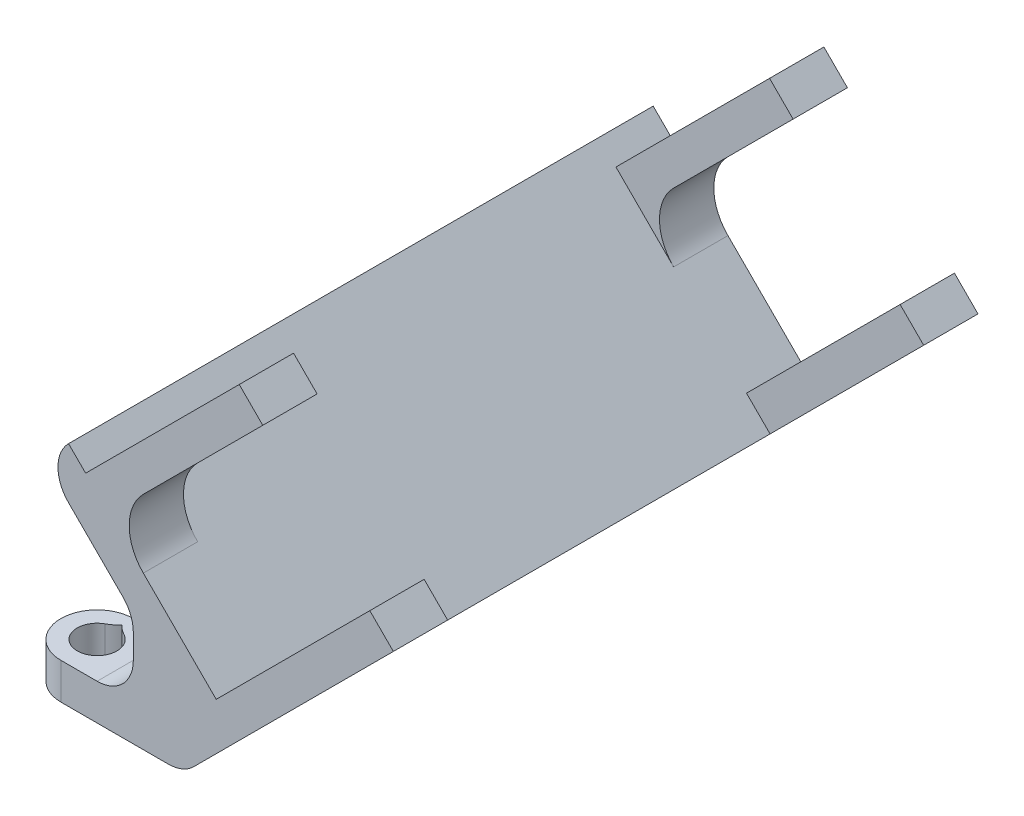
ISO-10303-21;
HEADER;
FILE_DESCRIPTION(('STEP AP214'),'2;1');
FILE_NAME('part.step','',(''),(''),'','','');
FILE_SCHEMA(('AUTOMOTIVE_DESIGN { 1 0 10303 214 1 1 1 1 }'));
ENDSEC;
DATA;
#1=APPLICATION_CONTEXT('core data for automotive mechanical design processes');
#2=APPLICATION_PROTOCOL_DEFINITION('international standard','automotive_design',2000,#1);
#3=PRODUCT_CONTEXT('',#1,'mechanical');
#4=PRODUCT('Part','Part','',(#3));
#5=PRODUCT_RELATED_PRODUCT_CATEGORY('part','',(#4));
#6=PRODUCT_DEFINITION_FORMATION('','',#4);
#7=PRODUCT_DEFINITION_CONTEXT('part definition',#1,'design');
#8=PRODUCT_DEFINITION('design','',#6,#7);
#9=PRODUCT_DEFINITION_SHAPE('','',#8);
#10=(LENGTH_UNIT() NAMED_UNIT(*) SI_UNIT(.MILLI.,.METRE.));
#11=(NAMED_UNIT(*) PLANE_ANGLE_UNIT() SI_UNIT($,.RADIAN.));
#12=(NAMED_UNIT(*) SI_UNIT($,.STERADIAN.) SOLID_ANGLE_UNIT());
#13=UNCERTAINTY_MEASURE_WITH_UNIT(LENGTH_MEASURE(1.E-05),#10,'distance_accuracy_value','');
#14=(GEOMETRIC_REPRESENTATION_CONTEXT(3) GLOBAL_UNCERTAINTY_ASSIGNED_CONTEXT((#13)) GLOBAL_UNIT_ASSIGNED_CONTEXT((#10,
#11,#12)) REPRESENTATION_CONTEXT('',''));
#15=CARTESIAN_POINT('',(0.,0.,0.));
#16=DIRECTION('',(0.,0.,1.));
#17=DIRECTION('',(1.,0.,0.));
#18=AXIS2_PLACEMENT_3D('',#15,#16,#17);
#19=CARTESIAN_POINT('',(-7.70161471607487,7.70161471607495,-24.22));
#20=DIRECTION('',(0.707106781186544,-0.707106781186551,0.));
#21=DIRECTION('',(0.707106781186551,0.707106781186544,0.));
#22=AXIS2_PLACEMENT_3D('',#19,#20,#21);
#23=PLANE('',#22);
#24=DIRECTION('',(0.,0.,1.));
#25=VECTOR('',#24,1.);
#26=CARTESIAN_POINT('',(2.04838528392516,17.4516147160749,-24.22));
#27=LINE('',#26,#25);
#28=CARTESIAN_POINT('',(2.04838528392516,17.4516147160749,-24.22));
#29=VERTEX_POINT('',#28);
#30=CARTESIAN_POINT('',(2.04838528392517,17.4516147160749,-19.72));
#31=VERTEX_POINT('',#30);
#32=EDGE_CURVE('E268',#29,#31,#27,.T.);
#33=ORIENTED_EDGE('',*,*,#32,.T.);
#34=DIRECTION('',(-0.707106781186551,-0.707106781186544,0.));
#35=VECTOR('',#34,1.);
#36=CARTESIAN_POINT('',(14.7763073452831,30.1795367774327,-19.72));
#37=LINE('',#36,#35);
#38=CARTESIAN_POINT('',(14.7763073452831,30.1795367774327,-19.72));
#39=VERTEX_POINT('',#38);
#40=EDGE_CURVE('E278',#39,#31,#37,.T.);
#41=ORIENTED_EDGE('',*,*,#40,.F.);
#42=DIRECTION('',(0.,0.,1.));
#43=VECTOR('',#42,1.);
#44=CARTESIAN_POINT('',(14.7763073452831,30.1795367774327,-24.22));
#45=LINE('',#44,#43);
#46=CARTESIAN_POINT('',(14.7763073452831,30.1795367774327,-24.22));
#47=VERTEX_POINT('',#46);
#48=EDGE_CURVE('E293',#47,#39,#45,.T.);
#49=ORIENTED_EDGE('',*,*,#48,.F.);
#50=DIRECTION('',(0.707106781186551,0.707106781186544,0.));
#51=VECTOR('',#50,1.);
#52=CARTESIAN_POINT('',(-7.70161471607487,7.70161471607495,-24.22));
#53=LINE('',#52,#51);
#54=EDGE_CURVE('E286',#29,#47,#53,.T.);
#55=ORIENTED_EDGE('',*,*,#54,.F.);
#56=EDGE_LOOP('',(#33,#41,#49,#55));
#57=FACE_BOUND('',#56,.T.);
#58=ADVANCED_FACE('F35',(#57),#23,.F.);
#59=CARTESIAN_POINT('',(22.477922061358,22.4779220613577,-24.22));
#60=DIRECTION('',(0.707106781186551,0.707106781186544,0.));
#61=DIRECTION('',(-0.707106781186544,0.707106781186551,0.));
#62=AXIS2_PLACEMENT_3D('',#59,#60,#61);
#63=PLANE('',#62);
#64=DIRECTION('',(-0.707106781186544,0.707106781186551,0.));
#65=VECTOR('',#64,1.);
#66=CARTESIAN_POINT('',(36.2512499681139,8.70459415460168,-19.72));
#67=LINE('',#66,#65);
#68=CARTESIAN_POINT('',(16.7279220613579,28.2279220613578,-19.72));
#69=VERTEX_POINT('',#68);
#70=EDGE_CURVE('E281',#69,#39,#67,.T.);
#71=ORIENTED_EDGE('',*,*,#70,.F.);
#72=DIRECTION('',(0.,0.,1.));
#73=VECTOR('',#72,1.);
#74=CARTESIAN_POINT('',(16.7279220613579,28.2279220613578,-24.22));
#75=LINE('',#74,#73);
#76=CARTESIAN_POINT('',(16.7279220613579,28.2279220613578,-24.22));
#77=VERTEX_POINT('',#76);
#78=EDGE_CURVE('E298',#77,#69,#75,.T.);
#79=ORIENTED_EDGE('',*,*,#78,.F.);
#80=DIRECTION('',(-0.707106781186544,0.707106781186551,0.));
#81=VECTOR('',#80,1.);
#82=CARTESIAN_POINT('',(22.477922061358,22.4779220613577,-24.22));
#83=LINE('',#82,#81);
#84=EDGE_CURVE('E512',#77,#47,#83,.T.);
#85=ORIENTED_EDGE('',*,*,#84,.T.);
#86=ORIENTED_EDGE('',*,*,#48,.T.);
#87=EDGE_LOOP('',(#71,#79,#85,#86));
#88=FACE_BOUND('',#87,.T.);
#89=ADVANCED_FACE('F597',(#88),#63,.T.);
#90=CARTESIAN_POINT('',(-5.75000000000001,5.75000000000007,-24.22));
#91=DIRECTION('',(0.707106781186544,-0.707106781186551,0.));
#92=DIRECTION('',(0.707106781186551,0.707106781186544,0.));
#93=AXIS2_PLACEMENT_3D('',#90,#91,#92);
#94=PLANE('',#93);
#95=DIRECTION('',(0.707106781186551,0.707106781186544,0.));
#96=VECTOR('',#95,1.);
#97=CARTESIAN_POINT('',(-5.75000000000001,5.75000000000007,-19.72));
#98=LINE('',#97,#96);
#99=CARTESIAN_POINT('',(6.82842712474622,18.3284271247462,-19.72));
#100=VERTEX_POINT('',#99);
#101=EDGE_CURVE('E465',#100,#69,#98,.T.);
#102=ORIENTED_EDGE('',*,*,#101,.F.);
#103=DIRECTION('',(0.,0.,1.));
#104=VECTOR('',#103,1.);
#105=CARTESIAN_POINT('',(6.82842712474622,18.3284271247462,-24.22));
#106=LINE('',#105,#104);
#107=CARTESIAN_POINT('',(6.82842712474623,18.3284271247462,-24.22));
#108=VERTEX_POINT('',#107);
#109=EDGE_CURVE('E442',#100,#108,#106,.F.);
#110=ORIENTED_EDGE('',*,*,#109,.T.);
#111=DIRECTION('',(0.707106781186551,0.707106781186544,0.));
#112=VECTOR('',#111,1.);
#113=CARTESIAN_POINT('',(-5.75000000000001,5.75000000000007,-24.22));
#114=LINE('',#113,#112);
#115=EDGE_CURVE('E456',#108,#77,#114,.T.);
#116=ORIENTED_EDGE('',*,*,#115,.T.);
#117=ORIENTED_EDGE('',*,*,#78,.T.);
#118=EDGE_LOOP('',(#102,#110,#116,#117));
#119=FACE_BOUND('',#118,.T.);
#120=ADVANCED_FACE('F467',(#119),#94,.T.);
#121=CARTESIAN_POINT('',(3.11711903607925,-3.11711903607928,-24.22));
#122=DIRECTION('',(0.707106781186544,-0.707106781186551,0.));
#123=DIRECTION('',(0.707106781186551,0.707106781186544,0.));
#124=AXIS2_PLACEMENT_3D('',#121,#122,#123);
#125=PLANE('',#124);
#126=DIRECTION('',(0.,0.,1.));
#127=VECTOR('',#126,1.);
#128=CARTESIAN_POINT('',(12.8671190360793,6.63288096392065,-24.22));
#129=LINE('',#128,#127);
#130=CARTESIAN_POINT('',(12.8671190360793,6.63288096392065,-24.22));
#131=VERTEX_POINT('',#130);
#132=CARTESIAN_POINT('',(12.8671190360793,6.63288096392065,-19.72));
#133=VERTEX_POINT('',#132);
#134=EDGE_CURVE('E302',#131,#133,#129,.T.);
#135=ORIENTED_EDGE('',*,*,#134,.T.);
#136=DIRECTION('',(0.707106781186551,0.707106781186544,0.));
#137=VECTOR('',#136,1.);
#138=CARTESIAN_POINT('',(3.11711903607925,-3.11711903607928,-19.72));
#139=LINE('',#138,#137);
#140=CARTESIAN_POINT('',(25.5950410974372,19.3608030252784,-19.72));
#141=VERTEX_POINT('',#140);
#142=EDGE_CURVE('E470',#133,#141,#139,.T.);
#143=ORIENTED_EDGE('',*,*,#142,.T.);
#144=DIRECTION('',(0.,0.,1.));
#145=VECTOR('',#144,1.);
#146=CARTESIAN_POINT('',(25.5950410974372,19.3608030252784,-24.22));
#147=LINE('',#146,#145);
#148=CARTESIAN_POINT('',(25.5950410974372,19.3608030252784,-24.22));
#149=VERTEX_POINT('',#148);
#150=EDGE_CURVE('E306',#149,#141,#147,.T.);
#151=ORIENTED_EDGE('',*,*,#150,.F.);
#152=DIRECTION('',(0.707106781186551,0.707106781186544,0.));
#153=VECTOR('',#152,1.);
#154=CARTESIAN_POINT('',(3.11711903607925,-3.11711903607928,-24.22));
#155=LINE('',#154,#153);
#156=EDGE_CURVE('E461',#131,#149,#155,.T.);
#157=ORIENTED_EDGE('',*,*,#156,.F.);
#158=EDGE_LOOP('',(#135,#143,#151,#157));
#159=FACE_BOUND('',#158,.T.);
#160=ADVANCED_FACE('F626',(#159),#125,.F.);
#161=CARTESIAN_POINT('',(22.477922061358,22.4779220613577,-24.22));
#162=DIRECTION('',(0.707106781186553,0.707106781186542,0.));
#163=DIRECTION('',(-0.707106781186542,0.707106781186553,0.));
#164=AXIS2_PLACEMENT_3D('',#161,#162,#163);
#165=PLANE('',#164);
#166=CARTESIAN_POINT('',(27.5466558135121,17.4091883092036,-19.72));
#167=VERTEX_POINT('',#166);
#168=EDGE_CURVE('E555',#167,#141,#67,.T.);
#169=ORIENTED_EDGE('',*,*,#168,.F.);
#170=DIRECTION('',(0.,0.,1.));
#171=VECTOR('',#170,1.);
#172=CARTESIAN_POINT('',(27.5466558135121,17.4091883092036,-24.22));
#173=LINE('',#172,#171);
#174=CARTESIAN_POINT('',(27.5466558135121,17.4091883092036,-24.22));
#175=VERTEX_POINT('',#174);
#176=EDGE_CURVE('E310',#175,#167,#173,.T.);
#177=ORIENTED_EDGE('',*,*,#176,.F.);
#178=DIRECTION('',(-0.707106781186542,0.707106781186553,0.));
#179=VECTOR('',#178,1.);
#180=CARTESIAN_POINT('',(22.477922061358,22.4779220613577,-24.22));
#181=LINE('',#180,#179);
#182=EDGE_CURVE('E507',#175,#149,#181,.T.);
#183=ORIENTED_EDGE('',*,*,#182,.T.);
#184=ORIENTED_EDGE('',*,*,#150,.T.);
#185=EDGE_LOOP('',(#169,#177,#183,#184));
#186=FACE_BOUND('',#185,.T.);
#187=ADVANCED_FACE('F554',(#186),#165,.T.);
#188=CARTESIAN_POINT('',(0.,3.,-21.22));
#189=DIRECTION('',(0.,-1.,0.));
#190=DIRECTION('',(0.,0.,-1.));
#191=AXIS2_PLACEMENT_3D('',#188,#189,#190);
#192=CYLINDRICAL_SURFACE('',#191,1.65);
#193=CARTESIAN_POINT('',(0.,0.,-21.22));
#194=DIRECTION('',(0.,1.,0.));
#195=DIRECTION('',(0.,0.,1.));
#196=AXIS2_PLACEMENT_3D('',#193,#194,#195);
#197=CIRCLE('',#196,1.65);
#198=CARTESIAN_POINT('',(-0.787400787401174,0.,-22.67));
#199=VERTEX_POINT('',#198);
#200=CARTESIAN_POINT('',(0.787400787401184,0.,-22.67));
#201=VERTEX_POINT('',#200);
#202=EDGE_CURVE('E366',#199,#201,#197,.T.);
#203=ORIENTED_EDGE('',*,*,#202,.F.);
#204=DIRECTION('',(0.,-1.,0.));
#205=VECTOR('',#204,1.);
#206=CARTESIAN_POINT('',(-0.787400787401174,3.,-22.67));
#207=LINE('',#206,#205);
#208=CARTESIAN_POINT('',(-0.787400787401174,3.,-22.67));
#209=VERTEX_POINT('',#208);
#210=EDGE_CURVE('E379',#209,#199,#207,.T.);
#211=ORIENTED_EDGE('',*,*,#210,.F.);
#212=CARTESIAN_POINT('',(0.,3.,-21.22));
#213=DIRECTION('',(0.,1.,0.));
#214=DIRECTION('',(0.,0.,1.));
#215=AXIS2_PLACEMENT_3D('',#212,#213,#214);
#216=CIRCLE('',#215,1.65);
#217=CARTESIAN_POINT('',(0.787400787401184,3.,-22.67));
#218=VERTEX_POINT('',#217);
#219=EDGE_CURVE('E336',#209,#218,#216,.T.);
#220=ORIENTED_EDGE('',*,*,#219,.T.);
#221=DIRECTION('',(0.,-1.,0.));
#222=VECTOR('',#221,1.);
#223=CARTESIAN_POINT('',(0.787400787401184,3.,-22.67));
#224=LINE('',#223,#222);
#225=EDGE_CURVE('E374',#218,#201,#224,.T.);
#226=ORIENTED_EDGE('',*,*,#225,.T.);
#227=EDGE_LOOP('',(#203,#211,#220,#226));
#228=FACE_BOUND('',#227,.T.);
#229=ADVANCED_FACE('F635',(#228),#192,.F.);
#230=CARTESIAN_POINT('',(-2.33070633070745,3.,-25.5119999999999));
#231=DIRECTION('',(0.,-1.,0.));
#232=DIRECTION('',(0.,0.,-1.));
#233=AXIS2_PLACEMENT_3D('',#230,#231,#232);
#234=CYLINDRICAL_SURFACE('',#233,3.23399999999994);
#235=CARTESIAN_POINT('',(-2.33070633070745,0.,-25.5119999999999));
#236=DIRECTION('',(0.,1.,0.));
#237=DIRECTION('',(0.,0.,1.));
#238=AXIS2_PLACEMENT_3D('',#235,#236,#237);
#239=CIRCLE('',#238,3.23399999999994);
#240=CARTESIAN_POINT('',(0.,0.,-23.27));
#241=VERTEX_POINT('',#240);
#242=EDGE_CURVE('E369',#199,#241,#239,.T.);
#243=ORIENTED_EDGE('',*,*,#242,.T.);
#244=DIRECTION('',(0.,-1.,0.));
#245=VECTOR('',#244,1.);
#246=CARTESIAN_POINT('',(0.,3.,-23.27));
#247=LINE('',#246,#245);
#248=CARTESIAN_POINT('',(0.,3.,-23.27));
#249=VERTEX_POINT('',#248);
#250=EDGE_CURVE('E376',#249,#241,#247,.T.);
#251=ORIENTED_EDGE('',*,*,#250,.F.);
#252=CARTESIAN_POINT('',(-2.33070633070745,3.,-25.5119999999999));
#253=DIRECTION('',(0.,1.,0.));
#254=DIRECTION('',(0.,0.,1.));
#255=AXIS2_PLACEMENT_3D('',#252,#253,#254);
#256=CIRCLE('',#255,3.23399999999994);
#257=EDGE_CURVE('E339',#209,#249,#256,.T.);
#258=ORIENTED_EDGE('',*,*,#257,.F.);
#259=ORIENTED_EDGE('',*,*,#210,.T.);
#260=EDGE_LOOP('',(#243,#251,#258,#259));
#261=FACE_BOUND('',#260,.T.);
#262=ADVANCED_FACE('F651',(#261),#234,.T.);
#263=CARTESIAN_POINT('',(0.,3.,21.22));
#264=DIRECTION('',(0.,-1.,0.));
#265=DIRECTION('',(0.,0.,-1.));
#266=AXIS2_PLACEMENT_3D('',#263,#264,#265);
#267=CYLINDRICAL_SURFACE('',#266,1.65);
#268=CARTESIAN_POINT('',(0.,0.,21.22));
#269=DIRECTION('',(0.,1.,0.));
#270=DIRECTION('',(0.,0.,1.));
#271=AXIS2_PLACEMENT_3D('',#268,#269,#270);
#272=CIRCLE('',#271,1.65);
#273=CARTESIAN_POINT('',(-0.787400787401175,0.,19.77));
#274=VERTEX_POINT('',#273);
#275=CARTESIAN_POINT('',(0.787400787401183,0.,19.77));
#276=VERTEX_POINT('',#275);
#277=EDGE_CURVE('E357',#274,#276,#272,.T.);
#278=ORIENTED_EDGE('',*,*,#277,.F.);
#279=DIRECTION('',(0.,-1.,0.));
#280=VECTOR('',#279,1.);
#281=CARTESIAN_POINT('',(-0.787400787401175,3.,19.77));
#282=LINE('',#281,#280);
#283=CARTESIAN_POINT('',(-0.787400787401175,3.,19.77));
#284=VERTEX_POINT('',#283);
#285=EDGE_CURVE('E377',#284,#274,#282,.T.);
#286=ORIENTED_EDGE('',*,*,#285,.F.);
#287=CARTESIAN_POINT('',(0.,3.,21.22));
#288=DIRECTION('',(0.,1.,0.));
#289=DIRECTION('',(0.,0.,1.));
#290=AXIS2_PLACEMENT_3D('',#287,#288,#289);
#291=CIRCLE('',#290,1.65);
#292=CARTESIAN_POINT('',(0.787400787401183,3.,19.77));
#293=VERTEX_POINT('',#292);
#294=EDGE_CURVE('E328',#284,#293,#291,.T.);
#295=ORIENTED_EDGE('',*,*,#294,.T.);
#296=DIRECTION('',(0.,-1.,0.));
#297=VECTOR('',#296,1.);
#298=CARTESIAN_POINT('',(0.787400787401183,3.,19.77));
#299=LINE('',#298,#297);
#300=EDGE_CURVE('E382',#293,#276,#299,.T.);
#301=ORIENTED_EDGE('',*,*,#300,.T.);
#302=EDGE_LOOP('',(#278,#286,#295,#301));
#303=FACE_BOUND('',#302,.T.);
#304=ADVANCED_FACE('F654',(#303),#267,.F.);
#305=CARTESIAN_POINT('',(-2.33070633070747,3.,16.928));
#306=DIRECTION('',(0.,-1.,0.));
#307=DIRECTION('',(0.,0.,-1.));
#308=AXIS2_PLACEMENT_3D('',#305,#306,#307);
#309=CYLINDRICAL_SURFACE('',#308,3.23399999999996);
#310=CARTESIAN_POINT('',(-2.33070633070747,0.,16.928));
#311=DIRECTION('',(0.,1.,0.));
#312=DIRECTION('',(0.,0.,1.));
#313=AXIS2_PLACEMENT_3D('',#310,#311,#312);
#314=CIRCLE('',#313,3.23399999999996);
#315=CARTESIAN_POINT('',(0.,0.,19.17));
#316=VERTEX_POINT('',#315);
#317=EDGE_CURVE('E360',#274,#316,#314,.T.);
#318=ORIENTED_EDGE('',*,*,#317,.T.);
#319=DIRECTION('',(0.,-1.,0.));
#320=VECTOR('',#319,1.);
#321=CARTESIAN_POINT('',(0.,3.,19.17));
#322=LINE('',#321,#320);
#323=CARTESIAN_POINT('',(0.,3.,19.17));
#324=VERTEX_POINT('',#323);
#325=EDGE_CURVE('E384',#324,#316,#322,.T.);
#326=ORIENTED_EDGE('',*,*,#325,.F.);
#327=CARTESIAN_POINT('',(-2.33070633070747,3.,16.928));
#328=DIRECTION('',(0.,1.,0.));
#329=DIRECTION('',(0.,0.,1.));
#330=AXIS2_PLACEMENT_3D('',#327,#328,#329);
#331=CIRCLE('',#330,3.23399999999996);
#332=EDGE_CURVE('E331',#284,#324,#331,.T.);
#333=ORIENTED_EDGE('',*,*,#332,.F.);
#334=ORIENTED_EDGE('',*,*,#285,.T.);
#335=EDGE_LOOP('',(#318,#326,#333,#334));
#336=FACE_BOUND('',#335,.T.);
#337=ADVANCED_FACE('F663',(#336),#309,.T.);
#338=CARTESIAN_POINT('',(0.,3.,0.));
#339=DIRECTION('',(1.,0.,0.));
#340=DIRECTION('',(0.,0.,-1.));
#341=AXIS2_PLACEMENT_3D('',#338,#339,#340);
#342=PLANE('',#341);
#343=DIRECTION('',(0.,0.,1.));
#344=VECTOR('',#343,1.);
#345=CARTESIAN_POINT('',(0.,0.,0.));
#346=LINE('',#345,#344);
#347=CARTESIAN_POINT('',(0.,0.,-18.22));
#348=VERTEX_POINT('',#347);
#349=CARTESIAN_POINT('',(0.,0.,18.22));
#350=VERTEX_POINT('',#349);
#351=EDGE_CURVE('E291',#348,#350,#346,.T.);
#352=ORIENTED_EDGE('',*,*,#351,.T.);
#353=DIRECTION('',(0.,-1.,0.));
#354=VECTOR('',#353,1.);
#355=CARTESIAN_POINT('',(0.,3.,18.22));
#356=LINE('',#355,#354);
#357=CARTESIAN_POINT('',(0.,3.,18.22));
#358=VERTEX_POINT('',#357);
#359=EDGE_CURVE('E385',#358,#350,#356,.T.);
#360=ORIENTED_EDGE('',*,*,#359,.F.);
#361=DIRECTION('',(0.,0.,1.));
#362=VECTOR('',#361,1.);
#363=CARTESIAN_POINT('',(0.,3.,0.));
#364=LINE('',#363,#362);
#365=CARTESIAN_POINT('',(0.,3.,-18.22));
#366=VERTEX_POINT('',#365);
#367=EDGE_CURVE('E314',#366,#358,#364,.T.);
#368=ORIENTED_EDGE('',*,*,#367,.F.);
#369=DIRECTION('',(0.,-1.,0.));
#370=VECTOR('',#369,1.);
#371=CARTESIAN_POINT('',(0.,3.,-18.22));
#372=LINE('',#371,#370);
#373=EDGE_CURVE('E344',#366,#348,#372,.T.);
#374=ORIENTED_EDGE('',*,*,#373,.T.);
#375=EDGE_LOOP('',(#352,#360,#368,#374));
#376=FACE_BOUND('',#375,.T.);
#377=ADVANCED_FACE('F666',(#376),#342,.F.);
#378=CARTESIAN_POINT('',(0.,3.,21.22));
#379=DIRECTION('',(0.,-1.,0.));
#380=DIRECTION('',(0.,0.,-1.));
#381=AXIS2_PLACEMENT_3D('',#378,#379,#380);
#382=CYLINDRICAL_SURFACE('',#381,3.);
#383=CARTESIAN_POINT('',(0.,0.,21.22));
#384=DIRECTION('',(0.,1.,0.));
#385=DIRECTION('',(0.,0.,1.));
#386=AXIS2_PLACEMENT_3D('',#383,#384,#385);
#387=CIRCLE('',#386,3.);
#388=CARTESIAN_POINT('',(0.,0.,24.22));
#389=VERTEX_POINT('',#388);
#390=EDGE_CURVE('E347',#350,#389,#387,.T.);
#391=ORIENTED_EDGE('',*,*,#390,.T.);
#392=DIRECTION('',(0.,-1.,0.));
#393=VECTOR('',#392,1.);
#394=CARTESIAN_POINT('',(0.,3.,24.22));
#395=LINE('',#394,#393);
#396=CARTESIAN_POINT('',(0.,3.,24.22));
#397=VERTEX_POINT('',#396);
#398=EDGE_CURVE('E392',#397,#389,#395,.T.);
#399=ORIENTED_EDGE('',*,*,#398,.F.);
#400=CARTESIAN_POINT('',(0.,3.,21.22));
#401=DIRECTION('',(0.,1.,0.));
#402=DIRECTION('',(0.,0.,1.));
#403=AXIS2_PLACEMENT_3D('',#400,#401,#402);
#404=CIRCLE('',#403,3.);
#405=EDGE_CURVE('E317',#358,#397,#404,.T.);
#406=ORIENTED_EDGE('',*,*,#405,.F.);
#407=ORIENTED_EDGE('',*,*,#359,.T.);
#408=EDGE_LOOP('',(#391,#399,#406,#407));
#409=FACE_BOUND('',#408,.T.);
#410=ADVANCED_FACE('F678',(#409),#382,.T.);
#411=CARTESIAN_POINT('',(0.,3.,24.22));
#412=DIRECTION('',(0.,0.,1.));
#413=DIRECTION('',(1.,0.,0.));
#414=AXIS2_PLACEMENT_3D('',#411,#412,#413);
#415=PLANE('',#414);
#416=DIRECTION('',(0.707106781186544,-0.707106781186551,0.));
#417=VECTOR('',#416,1.);
#418=CARTESIAN_POINT('',(9.75000000000003,9.74999999999993,24.22));
#419=LINE('',#418,#417);
#420=CARTESIAN_POINT('',(0.634171721552074,18.865828278448,24.22));
#421=VERTEX_POINT('',#420);
#422=CARTESIAN_POINT('',(2.04838528392516,17.4516147160749,24.22));
#423=VERTEX_POINT('',#422);
#424=EDGE_CURVE('E495',#421,#423,#419,.T.);
#425=ORIENTED_EDGE('',*,*,#424,.F.);
#426=CARTESIAN_POINT('',(2.7554920651117,16.7445079348883,24.22));
#427=DIRECTION('',(0.,0.,1.));
#428=DIRECTION('',(1.,0.,0.));
#429=AXIS2_PLACEMENT_3D('',#426,#427,#428);
#430=CIRCLE('',#429,3.);
#431=CARTESIAN_POINT('',(0.634171721552051,14.6231875913287,24.22));
#432=VERTEX_POINT('',#431);
#433=EDGE_CURVE('E425',#421,#432,#430,.T.);
#434=ORIENTED_EDGE('',*,*,#433,.T.);
#435=DIRECTION('',(-0.707106781186544,0.707106781186551,0.));
#436=VECTOR('',#435,1.);
#437=CARTESIAN_POINT('',(7.62867965644038,7.6286796564403,24.22));
#438=LINE('',#437,#436);
#439=CARTESIAN_POINT('',(5.12132034355966,10.136038969321,24.22));
#440=VERTEX_POINT('',#439);
#441=EDGE_CURVE('E498',#440,#432,#438,.T.);
#442=ORIENTED_EDGE('',*,*,#441,.F.);
#443=CARTESIAN_POINT('',(3.,8.01471862576142,24.22));
#444=DIRECTION('',(0.,0.,1.));
#445=DIRECTION('',(1.,0.,0.));
#446=AXIS2_PLACEMENT_3D('',#443,#444,#445);
#447=CIRCLE('',#446,3.);
#448=CARTESIAN_POINT('',(6.,8.01471862576142,24.22));
#449=VERTEX_POINT('',#448);
#450=EDGE_CURVE('E419',#440,#449,#447,.F.);
#451=ORIENTED_EDGE('',*,*,#450,.T.);
#452=DIRECTION('',(0.,-1.,0.));
#453=VECTOR('',#452,1.);
#454=CARTESIAN_POINT('',(6.,0.,24.22));
#455=LINE('',#454,#453);
#456=CARTESIAN_POINT('',(6.,6.,24.22));
#457=VERTEX_POINT('',#456);
#458=EDGE_CURVE('E501',#449,#457,#455,.T.);
#459=ORIENTED_EDGE('',*,*,#458,.T.);
#460=CARTESIAN_POINT('',(3.,6.,24.22));
#461=DIRECTION('',(0.,0.,1.));
#462=DIRECTION('',(1.,0.,0.));
#463=AXIS2_PLACEMENT_3D('',#460,#461,#462);
#464=CIRCLE('',#463,3.);
#465=CARTESIAN_POINT('',(3.,3.,24.22));
#466=VERTEX_POINT('',#465);
#467=EDGE_CURVE('E415',#457,#466,#464,.F.);
#468=ORIENTED_EDGE('',*,*,#467,.T.);
#469=DIRECTION('',(-1.,0.,0.));
#470=VECTOR('',#469,1.);
#471=CARTESIAN_POINT('',(0.,3.,24.22));
#472=LINE('',#471,#470);
#473=EDGE_CURVE('E321',#466,#397,#472,.T.);
#474=ORIENTED_EDGE('',*,*,#473,.T.);
#475=ORIENTED_EDGE('',*,*,#398,.T.);
#476=DIRECTION('',(-1.,0.,0.));
#477=VECTOR('',#476,1.);
#478=CARTESIAN_POINT('',(0.,0.,24.22));
#479=LINE('',#478,#477);
#480=CARTESIAN_POINT('',(8.89482681718906,0.,24.22));
#481=VERTEX_POINT('',#480);
#482=EDGE_CURVE('E350',#481,#389,#479,.T.);
#483=ORIENTED_EDGE('',*,*,#482,.F.);
#484=CARTESIAN_POINT('',(8.89482681718906,3.,24.22));
#485=DIRECTION('',(0.,0.,1.));
#486=DIRECTION('',(1.,0.,0.));
#487=AXIS2_PLACEMENT_3D('',#484,#485,#486);
#488=CIRCLE('',#487,3.);
#489=CARTESIAN_POINT('',(11.0161471607487,0.878679656440347,24.22));
#490=VERTEX_POINT('',#489);
#491=EDGE_CURVE('E423',#481,#490,#488,.T.);
#492=ORIENTED_EDGE('',*,*,#491,.T.);
#493=DIRECTION('',(-0.707106781186551,-0.707106781186544,0.));
#494=VECTOR('',#493,1.);
#495=CARTESIAN_POINT('',(5.06873375215411,-5.06873375215417,24.22));
#496=LINE('',#495,#494);
#497=CARTESIAN_POINT('',(27.5466558135121,17.4091883092036,24.22));
#498=VERTEX_POINT('',#497);
#499=EDGE_CURVE('E469',#498,#490,#496,.T.);
#500=ORIENTED_EDGE('',*,*,#499,.F.);
#501=DIRECTION('',(-0.707106781186542,0.707106781186553,0.));
#502=VECTOR('',#501,1.);
#503=CARTESIAN_POINT('',(22.477922061358,22.4779220613577,24.22));
#504=LINE('',#503,#502);
#505=CARTESIAN_POINT('',(25.5950410974372,19.3608030252784,24.22));
#506=VERTEX_POINT('',#505);
#507=EDGE_CURVE('E473',#498,#506,#504,.T.);
#508=ORIENTED_EDGE('',*,*,#507,.T.);
#509=DIRECTION('',(0.707106781186551,0.707106781186544,0.));
#510=VECTOR('',#509,1.);
#511=CARTESIAN_POINT('',(3.11711903607925,-3.11711903607928,24.22));
#512=LINE('',#511,#510);
#513=CARTESIAN_POINT('',(12.8671190360793,6.63288096392065,24.22));
#514=VERTEX_POINT('',#513);
#515=EDGE_CURVE('E482',#514,#506,#512,.T.);
#516=ORIENTED_EDGE('',*,*,#515,.F.);
#517=DIRECTION('',(0.707106781186544,-0.707106781186551,0.));
#518=VECTOR('',#517,1.);
#519=CARTESIAN_POINT('',(9.75000000000003,9.74999999999993,24.22));
#520=LINE('',#519,#518);
#521=CARTESIAN_POINT('',(6.8284271247462,12.6715728752538,24.22));
#522=VERTEX_POINT('',#521);
#523=EDGE_CURVE('E485',#522,#514,#520,.T.);
#524=ORIENTED_EDGE('',*,*,#523,.F.);
#525=CARTESIAN_POINT('',(9.6568542494924,15.5,24.22));
#526=DIRECTION('',(0.,0.,1.));
#527=DIRECTION('',(1.,0.,0.));
#528=AXIS2_PLACEMENT_3D('',#525,#526,#527);
#529=CIRCLE('',#528,4.);
#530=CARTESIAN_POINT('',(6.82842712474623,18.3284271247462,24.22));
#531=VERTEX_POINT('',#530);
#532=EDGE_CURVE('E43',#522,#531,#529,.F.);
#533=ORIENTED_EDGE('',*,*,#532,.T.);
#534=DIRECTION('',(0.707106781186551,0.707106781186544,0.));
#535=VECTOR('',#534,1.);
#536=CARTESIAN_POINT('',(-5.75000000000001,5.75000000000007,24.22));
#537=LINE('',#536,#535);
#538=CARTESIAN_POINT('',(16.7279220613579,28.2279220613578,24.22));
#539=VERTEX_POINT('',#538);
#540=EDGE_CURVE('E487',#531,#539,#537,.T.);
#541=ORIENTED_EDGE('',*,*,#540,.T.);
#542=DIRECTION('',(-0.707106781186544,0.707106781186551,0.));
#543=VECTOR('',#542,1.);
#544=CARTESIAN_POINT('',(22.477922061358,22.4779220613577,24.22));
#545=LINE('',#544,#543);
#546=CARTESIAN_POINT('',(14.7763073452831,30.1795367774327,24.22));
#547=VERTEX_POINT('',#546);
#548=EDGE_CURVE('E489',#539,#547,#545,.T.);
#549=ORIENTED_EDGE('',*,*,#548,.T.);
#550=DIRECTION('',(0.707106781186551,0.707106781186544,0.));
#551=VECTOR('',#550,1.);
#552=CARTESIAN_POINT('',(-7.70161471607487,7.70161471607495,24.22));
#553=LINE('',#552,#551);
#554=EDGE_CURVE('E492',#423,#547,#553,.T.);
#555=ORIENTED_EDGE('',*,*,#554,.F.);
#556=EDGE_LOOP('',(#425,#434,#442,#451,#459,#468,#474,#475,#483,#492,#500,#508,#516,#524,#533,
#541,#549,#555));
#557=FACE_BOUND('',#556,.T.);
#558=ADVANCED_FACE('F537',(#557),#415,.T.);
#559=CARTESIAN_POINT('',(0.,3.,-24.22));
#560=DIRECTION('',(0.,0.,-1.));
#561=DIRECTION('',(-1.,0.,0.));
#562=AXIS2_PLACEMENT_3D('',#559,#560,#561);
#563=PLANE('',#562);
#564=DIRECTION('',(-0.707106781186544,0.707106781186551,0.));
#565=VECTOR('',#564,1.);
#566=CARTESIAN_POINT('',(7.62867965644038,7.6286796564403,-24.22));
#567=LINE('',#566,#565);
#568=CARTESIAN_POINT('',(5.12132034355966,10.136038969321,-24.22));
#569=VERTEX_POINT('',#568);
#570=CARTESIAN_POINT('',(0.634171721552051,14.6231875913287,-24.22));
#571=VERTEX_POINT('',#570);
#572=EDGE_CURVE('E518',#569,#571,#567,.T.);
#573=ORIENTED_EDGE('',*,*,#572,.T.);
#574=CARTESIAN_POINT('',(2.7554920651117,16.7445079348883,-24.22));
#575=DIRECTION('',(0.,0.,-1.));
#576=DIRECTION('',(-1.,0.,0.));
#577=AXIS2_PLACEMENT_3D('',#574,#575,#576);
#578=CIRCLE('',#577,3.);
#579=CARTESIAN_POINT('',(0.634171721552074,18.865828278448,-24.22));
#580=VERTEX_POINT('',#579);
#581=EDGE_CURVE('E431',#571,#580,#578,.T.);
#582=ORIENTED_EDGE('',*,*,#581,.T.);
#583=DIRECTION('',(0.707106781186544,-0.707106781186551,0.));
#584=VECTOR('',#583,1.);
#585=CARTESIAN_POINT('',(9.75000000000003,9.74999999999993,-24.22));
#586=LINE('',#585,#584);
#587=EDGE_CURVE('E516',#580,#29,#586,.T.);
#588=ORIENTED_EDGE('',*,*,#587,.T.);
#589=ORIENTED_EDGE('',*,*,#54,.T.);
#590=ORIENTED_EDGE('',*,*,#84,.F.);
#591=ORIENTED_EDGE('',*,*,#115,.F.);
#592=CARTESIAN_POINT('',(9.6568542494924,15.5,-24.22));
#593=DIRECTION('',(0.,0.,-1.));
#594=DIRECTION('',(-1.,0.,0.));
#595=AXIS2_PLACEMENT_3D('',#592,#593,#594);
#596=CIRCLE('',#595,4.);
#597=CARTESIAN_POINT('',(6.8284271247462,12.6715728752538,-24.22));
#598=VERTEX_POINT('',#597);
#599=EDGE_CURVE('E447',#108,#598,#596,.F.);
#600=ORIENTED_EDGE('',*,*,#599,.T.);
#601=DIRECTION('',(0.707106781186544,-0.707106781186551,0.));
#602=VECTOR('',#601,1.);
#603=CARTESIAN_POINT('',(9.75000000000003,9.74999999999993,-24.22));
#604=LINE('',#603,#602);
#605=EDGE_CURVE('E453',#598,#131,#604,.T.);
#606=ORIENTED_EDGE('',*,*,#605,.T.);
#607=ORIENTED_EDGE('',*,*,#156,.T.);
#608=ORIENTED_EDGE('',*,*,#182,.F.);
#609=DIRECTION('',(-0.707106781186551,-0.707106781186544,0.));
#610=VECTOR('',#609,1.);
#611=CARTESIAN_POINT('',(5.06873375215411,-5.06873375215417,-24.22));
#612=LINE('',#611,#610);
#613=CARTESIAN_POINT('',(11.0161471607487,0.878679656440347,-24.22));
#614=VERTEX_POINT('',#613);
#615=EDGE_CURVE('E504',#175,#614,#612,.T.);
#616=ORIENTED_EDGE('',*,*,#615,.T.);
#617=CARTESIAN_POINT('',(8.89482681718906,3.,-24.22));
#618=DIRECTION('',(0.,0.,-1.));
#619=DIRECTION('',(-1.,0.,0.));
#620=AXIS2_PLACEMENT_3D('',#617,#618,#619);
#621=CIRCLE('',#620,3.);
#622=CARTESIAN_POINT('',(8.89482681718906,0.,-24.22));
#623=VERTEX_POINT('',#622);
#624=EDGE_CURVE('E429',#614,#623,#621,.T.);
#625=ORIENTED_EDGE('',*,*,#624,.T.);
#626=DIRECTION('',(1.,0.,0.));
#627=VECTOR('',#626,1.);
#628=CARTESIAN_POINT('',(0.,0.,-24.22));
#629=LINE('',#628,#627);
#630=CARTESIAN_POINT('',(0.,0.,-24.22));
#631=VERTEX_POINT('',#630);
#632=EDGE_CURVE('E352',#631,#623,#629,.T.);
#633=ORIENTED_EDGE('',*,*,#632,.F.);
#634=DIRECTION('',(0.,-1.,0.));
#635=VECTOR('',#634,1.);
#636=CARTESIAN_POINT('',(0.,3.,-24.22));
#637=LINE('',#636,#635);
#638=CARTESIAN_POINT('',(0.,3.,-24.22));
#639=VERTEX_POINT('',#638);
#640=EDGE_CURVE('E390',#639,#631,#637,.T.);
#641=ORIENTED_EDGE('',*,*,#640,.F.);
#642=DIRECTION('',(1.,0.,0.));
#643=VECTOR('',#642,1.);
#644=CARTESIAN_POINT('',(0.,3.,-24.22));
#645=LINE('',#644,#643);
#646=CARTESIAN_POINT('',(3.,3.,-24.22));
#647=VERTEX_POINT('',#646);
#648=EDGE_CURVE('E323',#639,#647,#645,.T.);
#649=ORIENTED_EDGE('',*,*,#648,.T.);
#650=CARTESIAN_POINT('',(3.,6.,-24.22));
#651=DIRECTION('',(0.,0.,-1.));
#652=DIRECTION('',(-1.,0.,0.));
#653=AXIS2_PLACEMENT_3D('',#650,#651,#652);
#654=CIRCLE('',#653,3.);
#655=CARTESIAN_POINT('',(6.,6.,-24.22));
#656=VERTEX_POINT('',#655);
#657=EDGE_CURVE('E417',#647,#656,#654,.F.);
#658=ORIENTED_EDGE('',*,*,#657,.T.);
#659=DIRECTION('',(0.,-1.,0.));
#660=VECTOR('',#659,1.);
#661=CARTESIAN_POINT('',(6.,0.,-24.22));
#662=LINE('',#661,#660);
#663=CARTESIAN_POINT('',(6.,8.01471862576142,-24.22));
#664=VERTEX_POINT('',#663);
#665=EDGE_CURVE('E519',#664,#656,#662,.T.);
#666=ORIENTED_EDGE('',*,*,#665,.F.);
#667=CARTESIAN_POINT('',(3.,8.01471862576142,-24.22));
#668=DIRECTION('',(0.,0.,-1.));
#669=DIRECTION('',(-1.,0.,0.));
#670=AXIS2_PLACEMENT_3D('',#667,#668,#669);
#671=CIRCLE('',#670,3.);
#672=EDGE_CURVE('E421',#664,#569,#671,.F.);
#673=ORIENTED_EDGE('',*,*,#672,.T.);
#674=EDGE_LOOP('',(#573,#582,#588,#589,#590,#591,#600,#606,#607,#608,#616,#625,#633,#641,#649,
#658,#666,#673));
#675=FACE_BOUND('',#674,.T.);
#676=ADVANCED_FACE('F452',(#675),#563,.T.);
#677=CARTESIAN_POINT('',(2.33070633070747,3.,16.928));
#678=DIRECTION('',(0.,-1.,0.));
#679=DIRECTION('',(0.,0.,-1.));
#680=AXIS2_PLACEMENT_3D('',#677,#678,#679);
#681=CYLINDRICAL_SURFACE('',#680,3.23399999999996);
#682=CARTESIAN_POINT('',(2.33070633070747,0.,16.928));
#683=DIRECTION('',(0.,1.,0.));
#684=DIRECTION('',(0.,0.,1.));
#685=AXIS2_PLACEMENT_3D('',#682,#683,#684);
#686=CIRCLE('',#685,3.23399999999996);
#687=EDGE_CURVE('E363',#276,#316,#686,.F.);
#688=ORIENTED_EDGE('',*,*,#687,.F.);
#689=ORIENTED_EDGE('',*,*,#300,.F.);
#690=CARTESIAN_POINT('',(2.33070633070747,3.,16.928));
#691=DIRECTION('',(0.,1.,0.));
#692=DIRECTION('',(0.,0.,1.));
#693=AXIS2_PLACEMENT_3D('',#690,#691,#692);
#694=CIRCLE('',#693,3.23399999999996);
#695=EDGE_CURVE('E333',#293,#324,#694,.F.);
#696=ORIENTED_EDGE('',*,*,#695,.T.);
#697=ORIENTED_EDGE('',*,*,#325,.T.);
#698=EDGE_LOOP('',(#688,#689,#696,#697));
#699=FACE_BOUND('',#698,.T.);
#700=ADVANCED_FACE('F659',(#699),#681,.T.);
#701=CARTESIAN_POINT('',(0.,3.,-21.22));
#702=DIRECTION('',(0.,-1.,0.));
#703=DIRECTION('',(0.,0.,-1.));
#704=AXIS2_PLACEMENT_3D('',#701,#702,#703);
#705=CYLINDRICAL_SURFACE('',#704,3.);
#706=CARTESIAN_POINT('',(0.,0.,-21.22));
#707=DIRECTION('',(0.,1.,0.));
#708=DIRECTION('',(0.,0.,1.));
#709=AXIS2_PLACEMENT_3D('',#706,#707,#708);
#710=CIRCLE('',#709,3.);
#711=EDGE_CURVE('E355',#631,#348,#710,.T.);
#712=ORIENTED_EDGE('',*,*,#711,.T.);
#713=ORIENTED_EDGE('',*,*,#373,.F.);
#714=CARTESIAN_POINT('',(0.,3.,-21.22));
#715=DIRECTION('',(0.,1.,0.));
#716=DIRECTION('',(0.,0.,1.));
#717=AXIS2_PLACEMENT_3D('',#714,#715,#716);
#718=CIRCLE('',#717,3.);
#719=EDGE_CURVE('E326',#639,#366,#718,.T.);
#720=ORIENTED_EDGE('',*,*,#719,.F.);
#721=ORIENTED_EDGE('',*,*,#640,.T.);
#722=EDGE_LOOP('',(#712,#713,#720,#721));
#723=FACE_BOUND('',#722,.T.);
#724=ADVANCED_FACE('F649',(#723),#705,.T.);
#725=CARTESIAN_POINT('',(2.33070633070746,3.,-25.5119999999999));
#726=DIRECTION('',(0.,-1.,0.));
#727=DIRECTION('',(0.,0.,-1.));
#728=AXIS2_PLACEMENT_3D('',#725,#726,#727);
#729=CYLINDRICAL_SURFACE('',#728,3.23399999999994);
#730=CARTESIAN_POINT('',(2.33070633070746,0.,-25.5119999999999));
#731=DIRECTION('',(0.,1.,0.));
#732=DIRECTION('',(0.,0.,1.));
#733=AXIS2_PLACEMENT_3D('',#730,#731,#732);
#734=CIRCLE('',#733,3.23399999999994);
#735=EDGE_CURVE('E318',#201,#241,#734,.F.);
#736=ORIENTED_EDGE('',*,*,#735,.F.);
#737=ORIENTED_EDGE('',*,*,#225,.F.);
#738=CARTESIAN_POINT('',(2.33070633070746,3.,-25.5119999999999));
#739=DIRECTION('',(0.,1.,0.));
#740=DIRECTION('',(0.,0.,1.));
#741=AXIS2_PLACEMENT_3D('',#738,#739,#740);
#742=CIRCLE('',#741,3.23399999999994);
#743=EDGE_CURVE('E341',#218,#249,#742,.F.);
#744=ORIENTED_EDGE('',*,*,#743,.T.);
#745=ORIENTED_EDGE('',*,*,#250,.T.);
#746=EDGE_LOOP('',(#736,#737,#744,#745));
#747=FACE_BOUND('',#746,.T.);
#748=ADVANCED_FACE('F642',(#747),#729,.T.);
#749=CARTESIAN_POINT('',(0.,3.,0.));
#750=DIRECTION('',(0.,1.,0.));
#751=DIRECTION('',(0.,0.,1.));
#752=AXIS2_PLACEMENT_3D('',#749,#750,#751);
#753=PLANE('',#752);
#754=ORIENTED_EDGE('',*,*,#473,.F.);
#755=DIRECTION('',(0.,0.,1.));
#756=VECTOR('',#755,1.);
#757=CARTESIAN_POINT('',(3.,3.,-24.22));
#758=LINE('',#757,#756);
#759=EDGE_CURVE('E410',#466,#647,#758,.F.);
#760=ORIENTED_EDGE('',*,*,#759,.T.);
#761=ORIENTED_EDGE('',*,*,#648,.F.);
#762=ORIENTED_EDGE('',*,*,#719,.T.);
#763=ORIENTED_EDGE('',*,*,#367,.T.);
#764=ORIENTED_EDGE('',*,*,#405,.T.);
#765=EDGE_LOOP('',(#754,#760,#761,#762,#763,#764));
#766=FACE_BOUND('',#765,.T.);
#767=ORIENTED_EDGE('',*,*,#294,.F.);
#768=ORIENTED_EDGE('',*,*,#332,.T.);
#769=ORIENTED_EDGE('',*,*,#695,.F.);
#770=EDGE_LOOP('',(#767,#768,#769));
#771=FACE_BOUND('',#770,.T.);
#772=ORIENTED_EDGE('',*,*,#219,.F.);
#773=ORIENTED_EDGE('',*,*,#257,.T.);
#774=ORIENTED_EDGE('',*,*,#743,.F.);
#775=EDGE_LOOP('',(#772,#773,#774));
#776=FACE_BOUND('',#775,.T.);
#777=ADVANCED_FACE('F639',(#766,#771,#776),#753,.T.);
#778=CARTESIAN_POINT('',(0.,0.,0.));
#779=DIRECTION('',(0.,1.,0.));
#780=DIRECTION('',(0.,0.,1.));
#781=AXIS2_PLACEMENT_3D('',#778,#779,#780);
#782=PLANE('',#781);
#783=ORIENTED_EDGE('',*,*,#632,.T.);
#784=DIRECTION('',(0.,0.,1.));
#785=VECTOR('',#784,1.);
#786=CARTESIAN_POINT('',(8.89482681718906,0.,0.));
#787=LINE('',#786,#785);
#788=EDGE_CURVE('E433',#623,#481,#787,.T.);
#789=ORIENTED_EDGE('',*,*,#788,.T.);
#790=ORIENTED_EDGE('',*,*,#482,.T.);
#791=ORIENTED_EDGE('',*,*,#390,.F.);
#792=ORIENTED_EDGE('',*,*,#351,.F.);
#793=ORIENTED_EDGE('',*,*,#711,.F.);
#794=EDGE_LOOP('',(#783,#789,#790,#791,#792,#793));
#795=FACE_BOUND('',#794,.T.);
#796=ORIENTED_EDGE('',*,*,#277,.T.);
#797=ORIENTED_EDGE('',*,*,#687,.T.);
#798=ORIENTED_EDGE('',*,*,#317,.F.);
#799=EDGE_LOOP('',(#796,#797,#798));
#800=FACE_BOUND('',#799,.T.);
#801=ORIENTED_EDGE('',*,*,#202,.T.);
#802=ORIENTED_EDGE('',*,*,#735,.T.);
#803=ORIENTED_EDGE('',*,*,#242,.F.);
#804=EDGE_LOOP('',(#801,#802,#803));
#805=FACE_BOUND('',#804,.T.);
#806=ADVANCED_FACE('F544',(#795,#800,#805),#782,.F.);
#807=CARTESIAN_POINT('',(6.,0.,-24.22));
#808=DIRECTION('',(-1.,0.,0.));
#809=DIRECTION('',(0.,0.,1.));
#810=AXIS2_PLACEMENT_3D('',#807,#808,#809);
#811=PLANE('',#810);
#812=ORIENTED_EDGE('',*,*,#665,.T.);
#813=DIRECTION('',(0.,0.,1.));
#814=VECTOR('',#813,1.);
#815=CARTESIAN_POINT('',(6.,6.,24.22));
#816=LINE('',#815,#814);
#817=EDGE_CURVE('E407',#656,#457,#816,.T.);
#818=ORIENTED_EDGE('',*,*,#817,.T.);
#819=ORIENTED_EDGE('',*,*,#458,.F.);
#820=DIRECTION('',(0.,0.,1.));
#821=VECTOR('',#820,1.);
#822=CARTESIAN_POINT('',(6.,8.01471862576142,-24.22));
#823=LINE('',#822,#821);
#824=EDGE_CURVE('E405',#449,#664,#823,.F.);
#825=ORIENTED_EDGE('',*,*,#824,.T.);
#826=EDGE_LOOP('',(#812,#818,#819,#825));
#827=FACE_BOUND('',#826,.T.);
#828=ADVANCED_FACE('F646',(#827),#811,.T.);
#829=CARTESIAN_POINT('',(7.62867965644038,7.6286796564403,-24.22));
#830=DIRECTION('',(0.707106781186551,0.707106781186544,0.));
#831=DIRECTION('',(-0.707106781186544,0.707106781186551,0.));
#832=AXIS2_PLACEMENT_3D('',#829,#830,#831);
#833=PLANE('',#832);
#834=ORIENTED_EDGE('',*,*,#441,.T.);
#835=DIRECTION('',(0.,0.,1.));
#836=VECTOR('',#835,1.);
#837=CARTESIAN_POINT('',(0.634171721552051,14.6231875913287,-24.22));
#838=LINE('',#837,#836);
#839=EDGE_CURVE('E427',#432,#571,#838,.F.);
#840=ORIENTED_EDGE('',*,*,#839,.T.);
#841=ORIENTED_EDGE('',*,*,#572,.F.);
#842=DIRECTION('',(0.,0.,1.));
#843=VECTOR('',#842,1.);
#844=CARTESIAN_POINT('',(5.12132034355966,10.136038969321,-24.22));
#845=LINE('',#844,#843);
#846=EDGE_CURVE('E412',#569,#440,#845,.T.);
#847=ORIENTED_EDGE('',*,*,#846,.T.);
#848=EDGE_LOOP('',(#834,#840,#841,#847));
#849=FACE_BOUND('',#848,.T.);
#850=ADVANCED_FACE('F615',(#849),#833,.F.);
#851=CARTESIAN_POINT('',(9.75000000000003,9.74999999999993,-24.22));
#852=DIRECTION('',(-0.707106781186551,-0.707106781186544,0.));
#853=DIRECTION('',(0.707106781186544,-0.707106781186551,0.));
#854=AXIS2_PLACEMENT_3D('',#851,#852,#853);
#855=PLANE('',#854);
#856=ORIENTED_EDGE('',*,*,#605,.F.);
#857=DIRECTION('',(0.,0.,1.));
#858=VECTOR('',#857,1.);
#859=CARTESIAN_POINT('',(6.8284271247462,12.6715728752538,-24.22));
#860=LINE('',#859,#858);
#861=CARTESIAN_POINT('',(6.8284271247462,12.6715728752538,-19.72));
#862=VERTEX_POINT('',#861);
#863=EDGE_CURVE('E271',#598,#862,#860,.T.);
#864=ORIENTED_EDGE('',*,*,#863,.T.);
#865=DIRECTION('',(-0.707106781186544,0.707106781186551,0.));
#866=VECTOR('',#865,1.);
#867=CARTESIAN_POINT('',(23.5233279067559,-4.0233279067561,-19.72));
#868=LINE('',#867,#866);
#869=EDGE_CURVE('E262',#862,#31,#868,.T.);
#870=ORIENTED_EDGE('',*,*,#869,.T.);
#871=ORIENTED_EDGE('',*,*,#32,.F.);
#872=ORIENTED_EDGE('',*,*,#587,.F.);
#873=DIRECTION('',(0.,0.,1.));
#874=VECTOR('',#873,1.);
#875=CARTESIAN_POINT('',(0.634171721552074,18.865828278448,-24.22));
#876=LINE('',#875,#874);
#877=EDGE_CURVE('E287',#580,#421,#876,.T.);
#878=ORIENTED_EDGE('',*,*,#877,.T.);
#879=ORIENTED_EDGE('',*,*,#424,.T.);
#880=CARTESIAN_POINT('',(2.04838528392518,17.4516147160749,19.72));
#881=VERTEX_POINT('',#880);
#882=EDGE_CURVE('E288',#881,#423,#27,.T.);
#883=ORIENTED_EDGE('',*,*,#882,.F.);
#884=DIRECTION('',(-0.707106781186544,0.707106781186551,0.));
#885=VECTOR('',#884,1.);
#886=CARTESIAN_POINT('',(23.5233279067559,-4.02332790675609,19.72));
#887=LINE('',#886,#885);
#888=CARTESIAN_POINT('',(6.82842712474621,12.6715728752538,19.72));
#889=VERTEX_POINT('',#888);
#890=EDGE_CURVE('E569',#889,#881,#887,.T.);
#891=ORIENTED_EDGE('',*,*,#890,.F.);
#892=DIRECTION('',(0.,0.,1.));
#893=VECTOR('',#892,1.);
#894=CARTESIAN_POINT('',(6.8284271247462,12.6715728752538,-24.22));
#895=LINE('',#894,#893);
#896=EDGE_CURVE('E438',#889,#522,#895,.T.);
#897=ORIENTED_EDGE('',*,*,#896,.T.);
#898=ORIENTED_EDGE('',*,*,#523,.T.);
#899=CARTESIAN_POINT('',(12.8671190360793,6.63288096392066,19.72));
#900=VERTEX_POINT('',#899);
#901=EDGE_CURVE('E305',#900,#514,#129,.T.);
#902=ORIENTED_EDGE('',*,*,#901,.F.);
#903=CARTESIAN_POINT('',(14.8187337521542,4.68126624784578,19.72));
#904=VERTEX_POINT('',#903);
#905=EDGE_CURVE('E568',#904,#900,#887,.T.);
#906=ORIENTED_EDGE('',*,*,#905,.F.);
#907=DIRECTION('',(0.,0.,1.));
#908=VECTOR('',#907,1.);
#909=CARTESIAN_POINT('',(14.8187337521542,4.68126624784577,-24.22));
#910=LINE('',#909,#908);
#911=CARTESIAN_POINT('',(14.8187337521542,4.68126624784576,-19.72));
#912=VERTEX_POINT('',#911);
#913=EDGE_CURVE('E381',#912,#904,#910,.T.);
#914=ORIENTED_EDGE('',*,*,#913,.F.);
#915=EDGE_CURVE('E274',#912,#133,#868,.T.);
#916=ORIENTED_EDGE('',*,*,#915,.T.);
#917=ORIENTED_EDGE('',*,*,#134,.F.);
#918=EDGE_LOOP('',(#856,#864,#870,#871,#872,#878,#879,#883,#891,#897,#898,#902,#906,#914,#916,#917));
#919=FACE_BOUND('',#918,.T.);
#920=ADVANCED_FACE('F265',(#919),#855,.F.);
#921=CARTESIAN_POINT('',(14.7763073452831,30.1795367774327,19.72));
#922=VERTEX_POINT('',#921);
#923=EDGE_CURVE('E297',#922,#547,#45,.T.);
#924=ORIENTED_EDGE('',*,*,#923,.F.);
#925=DIRECTION('',(0.707106781186551,0.707106781186544,0.));
#926=VECTOR('',#925,1.);
#927=CARTESIAN_POINT('',(14.7763073452831,30.1795367774327,19.72));
#928=LINE('',#927,#926);
#929=EDGE_CURVE('E275',#881,#922,#928,.T.);
#930=ORIENTED_EDGE('',*,*,#929,.F.);
#931=ORIENTED_EDGE('',*,*,#882,.T.);
#932=ORIENTED_EDGE('',*,*,#554,.T.);
#933=EDGE_LOOP('',(#924,#930,#931,#932));
#934=FACE_BOUND('',#933,.T.);
#935=ADVANCED_FACE('F599',(#934),#23,.F.);
#936=DIRECTION('',(-0.707106781186544,0.707106781186551,0.));
#937=VECTOR('',#936,1.);
#938=CARTESIAN_POINT('',(36.2512499681139,8.70459415460168,19.72));
#939=LINE('',#938,#937);
#940=CARTESIAN_POINT('',(16.7279220613579,28.2279220613578,19.72));
#941=VERTEX_POINT('',#940);
#942=EDGE_CURVE('E565',#941,#922,#939,.T.);
#943=ORIENTED_EDGE('',*,*,#942,.T.);
#944=ORIENTED_EDGE('',*,*,#923,.T.);
#945=ORIENTED_EDGE('',*,*,#548,.F.);
#946=EDGE_CURVE('E301',#941,#539,#75,.T.);
#947=ORIENTED_EDGE('',*,*,#946,.F.);
#948=EDGE_LOOP('',(#943,#944,#945,#947));
#949=FACE_BOUND('',#948,.T.);
#950=ADVANCED_FACE('F605',(#949),#63,.T.);
#951=ORIENTED_EDGE('',*,*,#540,.F.);
#952=DIRECTION('',(0.,0.,1.));
#953=VECTOR('',#952,1.);
#954=CARTESIAN_POINT('',(6.82842712474622,18.3284271247462,-24.22));
#955=LINE('',#954,#953);
#956=CARTESIAN_POINT('',(6.82842712474623,18.3284271247462,19.72));
#957=VERTEX_POINT('',#956);
#958=EDGE_CURVE('E56',#531,#957,#955,.F.);
#959=ORIENTED_EDGE('',*,*,#958,.T.);
#960=DIRECTION('',(-0.707106781186551,-0.707106781186544,0.));
#961=VECTOR('',#960,1.);
#962=CARTESIAN_POINT('',(-5.75,5.75000000000007,19.72));
#963=LINE('',#962,#961);
#964=EDGE_CURVE('E476',#941,#957,#963,.T.);
#965=ORIENTED_EDGE('',*,*,#964,.F.);
#966=ORIENTED_EDGE('',*,*,#946,.T.);
#967=EDGE_LOOP('',(#951,#959,#965,#966));
#968=FACE_BOUND('',#967,.T.);
#969=ADVANCED_FACE('F613',(#968),#94,.T.);
#970=CARTESIAN_POINT('',(25.5950410974372,19.3608030252784,19.72));
#971=VERTEX_POINT('',#970);
#972=EDGE_CURVE('E309',#971,#506,#147,.T.);
#973=ORIENTED_EDGE('',*,*,#972,.F.);
#974=DIRECTION('',(-0.707106781186551,-0.707106781186544,0.));
#975=VECTOR('',#974,1.);
#976=CARTESIAN_POINT('',(3.11711903607926,-3.11711903607928,19.72));
#977=LINE('',#976,#975);
#978=EDGE_CURVE('E558',#971,#900,#977,.T.);
#979=ORIENTED_EDGE('',*,*,#978,.T.);
#980=ORIENTED_EDGE('',*,*,#901,.T.);
#981=ORIENTED_EDGE('',*,*,#515,.T.);
#982=EDGE_LOOP('',(#973,#979,#980,#981));
#983=FACE_BOUND('',#982,.T.);
#984=ADVANCED_FACE('F581',(#983),#125,.F.);
#985=CARTESIAN_POINT('',(27.5466558135121,17.4091883092036,19.72));
#986=VERTEX_POINT('',#985);
#987=EDGE_CURVE('E562',#986,#971,#939,.T.);
#988=ORIENTED_EDGE('',*,*,#987,.T.);
#989=ORIENTED_EDGE('',*,*,#972,.T.);
#990=ORIENTED_EDGE('',*,*,#507,.F.);
#991=EDGE_CURVE('E313',#986,#498,#173,.T.);
#992=ORIENTED_EDGE('',*,*,#991,.F.);
#993=EDGE_LOOP('',(#988,#989,#990,#992));
#994=FACE_BOUND('',#993,.T.);
#995=ADVANCED_FACE('F533',(#994),#165,.T.);
#996=CARTESIAN_POINT('',(5.06873375215411,-5.06873375215417,-24.22));
#997=DIRECTION('',(-0.707106781186544,0.707106781186551,0.));
#998=DIRECTION('',(-0.707106781186551,-0.707106781186544,0.));
#999=AXIS2_PLACEMENT_3D('',#996,#997,#998);
#1000=PLANE('',#999);
#1001=ORIENTED_EDGE('',*,*,#499,.T.);
#1002=DIRECTION('',(0.,0.,1.));
#1003=VECTOR('',#1002,1.);
#1004=CARTESIAN_POINT('',(11.0161471607487,0.878679656440345,-24.22));
#1005=LINE('',#1004,#1003);
#1006=EDGE_CURVE('E436',#490,#614,#1005,.F.);
#1007=ORIENTED_EDGE('',*,*,#1006,.T.);
#1008=ORIENTED_EDGE('',*,*,#615,.F.);
#1009=ORIENTED_EDGE('',*,*,#176,.T.);
#1010=DIRECTION('',(-0.707106781186551,-0.707106781186544,0.));
#1011=VECTOR('',#1010,1.);
#1012=CARTESIAN_POINT('',(5.06873375215411,-5.06873375215417,-19.72));
#1013=LINE('',#1012,#1011);
#1014=EDGE_CURVE('E402',#167,#912,#1013,.T.);
#1015=ORIENTED_EDGE('',*,*,#1014,.T.);
#1016=ORIENTED_EDGE('',*,*,#913,.T.);
#1017=DIRECTION('',(0.707106781186551,0.707106781186544,0.));
#1018=VECTOR('',#1017,1.);
#1019=CARTESIAN_POINT('',(5.06873375215412,-5.06873375215416,19.72));
#1020=LINE('',#1019,#1018);
#1021=EDGE_CURVE('E399',#904,#986,#1020,.T.);
#1022=ORIENTED_EDGE('',*,*,#1021,.T.);
#1023=ORIENTED_EDGE('',*,*,#991,.T.);
#1024=EDGE_LOOP('',(#1001,#1007,#1008,#1009,#1015,#1016,#1022,#1023));
#1025=FACE_BOUND('',#1024,.T.);
#1026=ADVANCED_FACE('F527',(#1025),#1000,.F.);
#1027=CARTESIAN_POINT('',(36.2512499681139,8.70459415460168,19.72));
#1028=DIRECTION('',(0.,0.,1.));
#1029=DIRECTION('',(1.,0.,0.));
#1030=AXIS2_PLACEMENT_3D('',#1027,#1028,#1029);
#1031=PLANE('',#1030);
#1032=ORIENTED_EDGE('',*,*,#987,.F.);
#1033=ORIENTED_EDGE('',*,*,#1021,.F.);
#1034=ORIENTED_EDGE('',*,*,#905,.T.);
#1035=ORIENTED_EDGE('',*,*,#978,.F.);
#1036=EDGE_LOOP('',(#1032,#1033,#1034,#1035));
#1037=FACE_BOUND('',#1036,.T.);
#1038=ADVANCED_FACE('F584',(#1037),#1031,.F.);
#1039=CARTESIAN_POINT('',(36.2512499681139,8.70459415460168,-19.72));
#1040=DIRECTION('',(0.,0.,-1.));
#1041=DIRECTION('',(-1.,0.,0.));
#1042=AXIS2_PLACEMENT_3D('',#1039,#1040,#1041);
#1043=PLANE('',#1042);
#1044=ORIENTED_EDGE('',*,*,#915,.F.);
#1045=ORIENTED_EDGE('',*,*,#1014,.F.);
#1046=ORIENTED_EDGE('',*,*,#168,.T.);
#1047=ORIENTED_EDGE('',*,*,#142,.F.);
#1048=EDGE_LOOP('',(#1044,#1045,#1046,#1047));
#1049=FACE_BOUND('',#1048,.T.);
#1050=ADVANCED_FACE('F586',(#1049),#1043,.F.);
#1051=ORIENTED_EDGE('',*,*,#869,.F.);
#1052=CARTESIAN_POINT('',(9.6568542494924,15.5,-19.72));
#1053=DIRECTION('',(0.,0.,-1.));
#1054=DIRECTION('',(-1.,0.,0.));
#1055=AXIS2_PLACEMENT_3D('',#1052,#1053,#1054);
#1056=CIRCLE('',#1055,4.);
#1057=EDGE_CURVE('E445',#862,#100,#1056,.T.);
#1058=ORIENTED_EDGE('',*,*,#1057,.T.);
#1059=ORIENTED_EDGE('',*,*,#101,.T.);
#1060=ORIENTED_EDGE('',*,*,#70,.T.);
#1061=ORIENTED_EDGE('',*,*,#40,.T.);
#1062=EDGE_LOOP('',(#1051,#1058,#1059,#1060,#1061));
#1063=FACE_BOUND('',#1062,.T.);
#1064=ADVANCED_FACE('F279',(#1063),#1043,.F.);
#1065=ORIENTED_EDGE('',*,*,#964,.T.);
#1066=CARTESIAN_POINT('',(9.6568542494924,15.5,19.72));
#1067=DIRECTION('',(0.,0.,1.));
#1068=DIRECTION('',(1.,0.,0.));
#1069=AXIS2_PLACEMENT_3D('',#1066,#1067,#1068);
#1070=CIRCLE('',#1069,4.);
#1071=EDGE_CURVE('E11',#957,#889,#1070,.T.);
#1072=ORIENTED_EDGE('',*,*,#1071,.T.);
#1073=ORIENTED_EDGE('',*,*,#890,.T.);
#1074=ORIENTED_EDGE('',*,*,#929,.T.);
#1075=ORIENTED_EDGE('',*,*,#942,.F.);
#1076=EDGE_LOOP('',(#1065,#1072,#1073,#1074,#1075));
#1077=FACE_BOUND('',#1076,.T.);
#1078=ADVANCED_FACE('F572',(#1077),#1031,.F.);
#1079=CARTESIAN_POINT('',(3.,6.,-24.22));
#1080=DIRECTION('',(0.,0.,-1.));
#1081=DIRECTION('',(-1.,0.,0.));
#1082=AXIS2_PLACEMENT_3D('',#1079,#1080,#1081);
#1083=CYLINDRICAL_SURFACE('',#1082,3.);
#1084=ORIENTED_EDGE('',*,*,#657,.F.);
#1085=ORIENTED_EDGE('',*,*,#759,.F.);
#1086=ORIENTED_EDGE('',*,*,#467,.F.);
#1087=ORIENTED_EDGE('',*,*,#817,.F.);
#1088=EDGE_LOOP('',(#1084,#1085,#1086,#1087));
#1089=FACE_BOUND('',#1088,.T.);
#1090=ADVANCED_FACE('F595',(#1089),#1083,.F.);
#1091=CARTESIAN_POINT('',(3.,8.01471862576142,-24.22));
#1092=DIRECTION('',(0.,0.,1.));
#1093=DIRECTION('',(1.,0.,0.));
#1094=AXIS2_PLACEMENT_3D('',#1091,#1092,#1093);
#1095=CYLINDRICAL_SURFACE('',#1094,3.);
#1096=ORIENTED_EDGE('',*,*,#672,.F.);
#1097=ORIENTED_EDGE('',*,*,#824,.F.);
#1098=ORIENTED_EDGE('',*,*,#450,.F.);
#1099=ORIENTED_EDGE('',*,*,#846,.F.);
#1100=EDGE_LOOP('',(#1096,#1097,#1098,#1099));
#1101=FACE_BOUND('',#1100,.T.);
#1102=ADVANCED_FACE('F687',(#1101),#1095,.F.);
#1103=CARTESIAN_POINT('',(2.7554920651117,16.7445079348883,-24.22));
#1104=DIRECTION('',(0.,0.,1.));
#1105=DIRECTION('',(1.,0.,0.));
#1106=AXIS2_PLACEMENT_3D('',#1103,#1104,#1105);
#1107=CYLINDRICAL_SURFACE('',#1106,3.);
#1108=ORIENTED_EDGE('',*,*,#581,.F.);
#1109=ORIENTED_EDGE('',*,*,#839,.F.);
#1110=ORIENTED_EDGE('',*,*,#433,.F.);
#1111=ORIENTED_EDGE('',*,*,#877,.F.);
#1112=EDGE_LOOP('',(#1108,#1109,#1110,#1111));
#1113=FACE_BOUND('',#1112,.T.);
#1114=ADVANCED_FACE('F691',(#1113),#1107,.T.);
#1115=CARTESIAN_POINT('',(8.89482681718906,3.,0.));
#1116=DIRECTION('',(0.,0.,1.));
#1117=DIRECTION('',(1.,0.,0.));
#1118=AXIS2_PLACEMENT_3D('',#1115,#1116,#1117);
#1119=CYLINDRICAL_SURFACE('',#1118,3.);
#1120=ORIENTED_EDGE('',*,*,#624,.F.);
#1121=ORIENTED_EDGE('',*,*,#1006,.F.);
#1122=ORIENTED_EDGE('',*,*,#491,.F.);
#1123=ORIENTED_EDGE('',*,*,#788,.F.);
#1124=EDGE_LOOP('',(#1120,#1121,#1122,#1123));
#1125=FACE_BOUND('',#1124,.T.);
#1126=ADVANCED_FACE('F542',(#1125),#1119,.T.);
#1127=CARTESIAN_POINT('',(9.6568542494924,15.5,-24.22));
#1128=DIRECTION('',(0.,0.,1.));
#1129=DIRECTION('',(1.,0.,0.));
#1130=AXIS2_PLACEMENT_3D('',#1127,#1128,#1129);
#1131=CYLINDRICAL_SURFACE('',#1130,4.);
#1132=ORIENTED_EDGE('',*,*,#599,.F.);
#1133=ORIENTED_EDGE('',*,*,#109,.F.);
#1134=ORIENTED_EDGE('',*,*,#1057,.F.);
#1135=ORIENTED_EDGE('',*,*,#863,.F.);
#1136=EDGE_LOOP('',(#1132,#1133,#1134,#1135));
#1137=FACE_BOUND('',#1136,.T.);
#1138=ADVANCED_FACE('F463',(#1137),#1131,.F.);
#1139=CARTESIAN_POINT('',(9.6568542494924,15.5,-24.22));
#1140=DIRECTION('',(0.,0.,1.));
#1141=DIRECTION('',(1.,0.,0.));
#1142=AXIS2_PLACEMENT_3D('',#1139,#1140,#1141);
#1143=CYLINDRICAL_SURFACE('',#1142,4.);
#1144=ORIENTED_EDGE('',*,*,#1071,.F.);
#1145=ORIENTED_EDGE('',*,*,#958,.F.);
#1146=ORIENTED_EDGE('',*,*,#532,.F.);
#1147=ORIENTED_EDGE('',*,*,#896,.F.);
#1148=EDGE_LOOP('',(#1144,#1145,#1146,#1147));
#1149=FACE_BOUND('',#1148,.T.);
#1150=ADVANCED_FACE('F37',(#1149),#1143,.F.);
#1151=CLOSED_SHELL('',(#58,#89,#120,#160,#187,#229,#262,#304,#337,#377,#410,#558,#676,#700,#724,
#748,#777,#806,#828,#850,#920,#935,#950,#969,#984,#995,#1026,#1038,#1050,#1064,#1078,#1090,
#1102,#1114,#1126,#1138,#1150));
#1152=MANIFOLD_SOLID_BREP('B2',#1151);
#1153=ADVANCED_BREP_SHAPE_REPRESENTATION('',(#18,#1152),#14);
#1154=SHAPE_DEFINITION_REPRESENTATION(#9,#1153);
ENDSEC;
END-ISO-10303-21;
